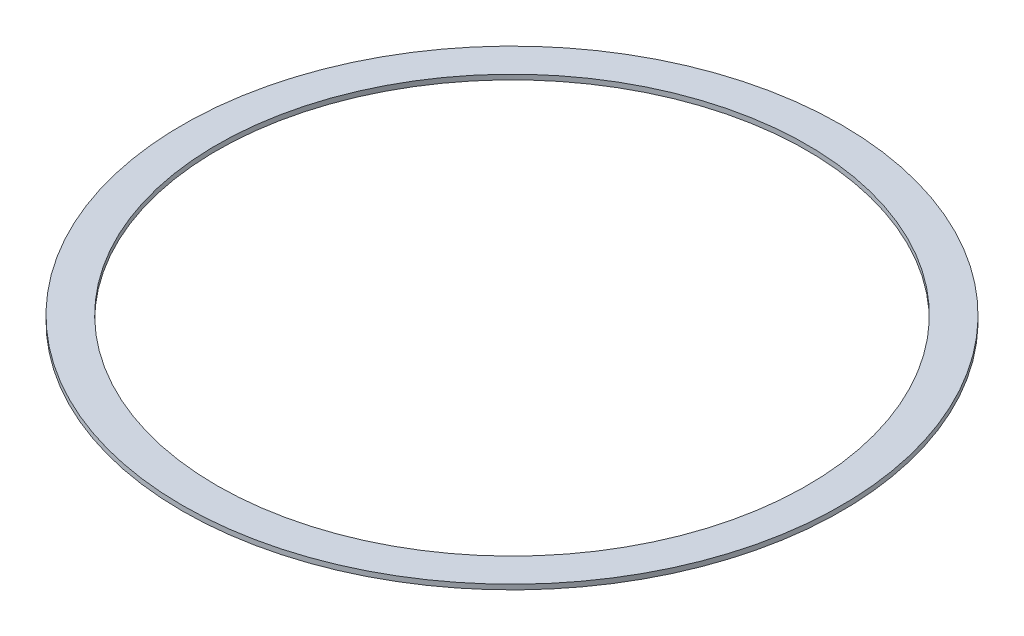
ISO-10303-21;
HEADER;
FILE_DESCRIPTION(('STEP AP214'),'2;1');
FILE_NAME('part.step','',(''),(''),'','','');
FILE_SCHEMA(('AUTOMOTIVE_DESIGN { 1 0 10303 214 1 1 1 1 }'));
ENDSEC;
DATA;
#1=APPLICATION_CONTEXT('core data for automotive mechanical design processes');
#2=APPLICATION_PROTOCOL_DEFINITION('international standard','automotive_design',2000,#1);
#3=PRODUCT_CONTEXT('',#1,'mechanical');
#4=PRODUCT('Part','Part','',(#3));
#5=PRODUCT_RELATED_PRODUCT_CATEGORY('part','',(#4));
#6=PRODUCT_DEFINITION_FORMATION('','',#4);
#7=PRODUCT_DEFINITION_CONTEXT('part definition',#1,'design');
#8=PRODUCT_DEFINITION('design','',#6,#7);
#9=PRODUCT_DEFINITION_SHAPE('','',#8);
#10=(LENGTH_UNIT() NAMED_UNIT(*) SI_UNIT(.MILLI.,.METRE.));
#11=(NAMED_UNIT(*) PLANE_ANGLE_UNIT() SI_UNIT($,.RADIAN.));
#12=(NAMED_UNIT(*) SI_UNIT($,.STERADIAN.) SOLID_ANGLE_UNIT());
#13=UNCERTAINTY_MEASURE_WITH_UNIT(LENGTH_MEASURE(1.E-05),#10,'distance_accuracy_value','');
#14=(GEOMETRIC_REPRESENTATION_CONTEXT(3) GLOBAL_UNCERTAINTY_ASSIGNED_CONTEXT((#13)) GLOBAL_UNIT_ASSIGNED_CONTEXT((#10,
#11,#12)) REPRESENTATION_CONTEXT('',''));
#15=CARTESIAN_POINT('',(0.,0.,0.));
#16=DIRECTION('',(0.,0.,1.));
#17=DIRECTION('',(1.,0.,0.));
#18=AXIS2_PLACEMENT_3D('',#15,#16,#17);
#19=CARTESIAN_POINT('',(0.,0.5,0.));
#20=DIRECTION('',(0.,1.,0.));
#21=DIRECTION('',(0.,0.,1.));
#22=AXIS2_PLACEMENT_3D('',#19,#20,#21);
#23=PLANE('',#22);
#24=CARTESIAN_POINT('',(0.,0.5,0.));
#25=DIRECTION('',(0.,1.,0.));
#26=DIRECTION('',(0.,0.,1.));
#27=AXIS2_PLACEMENT_3D('',#24,#25,#26);
#28=CIRCLE('',#27,67.);
#29=CARTESIAN_POINT('',(0.,0.5,67.));
#30=VERTEX_POINT('',#29);
#31=EDGE_CURVE('E10',#30,#30,#28,.T.);
#32=ORIENTED_EDGE('',*,*,#31,.T.);
#33=EDGE_LOOP('',(#32));
#34=FACE_BOUND('',#33,.T.);
#35=CARTESIAN_POINT('',(0.,0.5,0.));
#36=DIRECTION('',(0.,1.,0.));
#37=DIRECTION('',(0.,0.,1.));
#38=AXIS2_PLACEMENT_3D('',#35,#36,#37);
#39=CIRCLE('',#38,60.);
#40=CARTESIAN_POINT('',(0.,0.5,60.));
#41=VERTEX_POINT('',#40);
#42=EDGE_CURVE('E44',#41,#41,#39,.T.);
#43=ORIENTED_EDGE('',*,*,#42,.F.);
#44=EDGE_LOOP('',(#43));
#45=FACE_BOUND('',#44,.T.);
#46=ADVANCED_FACE('F33',(#34,#45),#23,.T.);
#47=CARTESIAN_POINT('',(0.,-0.5,0.));
#48=DIRECTION('',(0.,1.,0.));
#49=DIRECTION('',(0.,0.,1.));
#50=AXIS2_PLACEMENT_3D('',#47,#48,#49);
#51=PLANE('',#50);
#52=CARTESIAN_POINT('',(0.,-0.5,0.));
#53=DIRECTION('',(0.,1.,0.));
#54=DIRECTION('',(0.,0.,1.));
#55=AXIS2_PLACEMENT_3D('',#52,#53,#54);
#56=CIRCLE('',#55,67.);
#57=CARTESIAN_POINT('',(0.,-0.5,67.));
#58=VERTEX_POINT('',#57);
#59=EDGE_CURVE('E37',#58,#58,#56,.T.);
#60=ORIENTED_EDGE('',*,*,#59,.F.);
#61=EDGE_LOOP('',(#60));
#62=FACE_BOUND('',#61,.T.);
#63=CARTESIAN_POINT('',(0.,-0.5,0.));
#64=DIRECTION('',(0.,1.,0.));
#65=DIRECTION('',(0.,0.,1.));
#66=AXIS2_PLACEMENT_3D('',#63,#64,#65);
#67=CIRCLE('',#66,60.);
#68=CARTESIAN_POINT('',(0.,-0.5,60.));
#69=VERTEX_POINT('',#68);
#70=EDGE_CURVE('E46',#69,#69,#67,.T.);
#71=ORIENTED_EDGE('',*,*,#70,.T.);
#72=EDGE_LOOP('',(#71));
#73=FACE_BOUND('',#72,.T.);
#74=ADVANCED_FACE('F56',(#62,#73),#51,.F.);
#75=CARTESIAN_POINT('',(0.,0.5,0.));
#76=DIRECTION('',(0.,-1.,0.));
#77=DIRECTION('',(0.,0.,-1.));
#78=AXIS2_PLACEMENT_3D('',#75,#76,#77);
#79=CYLINDRICAL_SURFACE('',#78,67.);
#80=ORIENTED_EDGE('',*,*,#31,.F.);
#81=EDGE_LOOP('',(#80));
#82=FACE_BOUND('',#81,.T.);
#83=ORIENTED_EDGE('',*,*,#59,.T.);
#84=EDGE_LOOP('',(#83));
#85=FACE_BOUND('',#84,.T.);
#86=ADVANCED_FACE('F35',(#82,#85),#79,.T.);
#87=CARTESIAN_POINT('',(0.,0.5,0.));
#88=DIRECTION('',(0.,-1.,0.));
#89=DIRECTION('',(0.,0.,-1.));
#90=AXIS2_PLACEMENT_3D('',#87,#88,#89);
#91=CYLINDRICAL_SURFACE('',#90,60.);
#92=ORIENTED_EDGE('',*,*,#42,.T.);
#93=EDGE_LOOP('',(#92));
#94=FACE_BOUND('',#93,.T.);
#95=ORIENTED_EDGE('',*,*,#70,.F.);
#96=EDGE_LOOP('',(#95));
#97=FACE_BOUND('',#96,.T.);
#98=ADVANCED_FACE('F52',(#94,#97),#91,.F.);
#99=CLOSED_SHELL('',(#46,#74,#86,#98));
#100=MANIFOLD_SOLID_BREP('B2',#99);
#101=ADVANCED_BREP_SHAPE_REPRESENTATION('',(#18,#100),#14);
#102=SHAPE_DEFINITION_REPRESENTATION(#9,#101);
ENDSEC;
END-ISO-10303-21;
